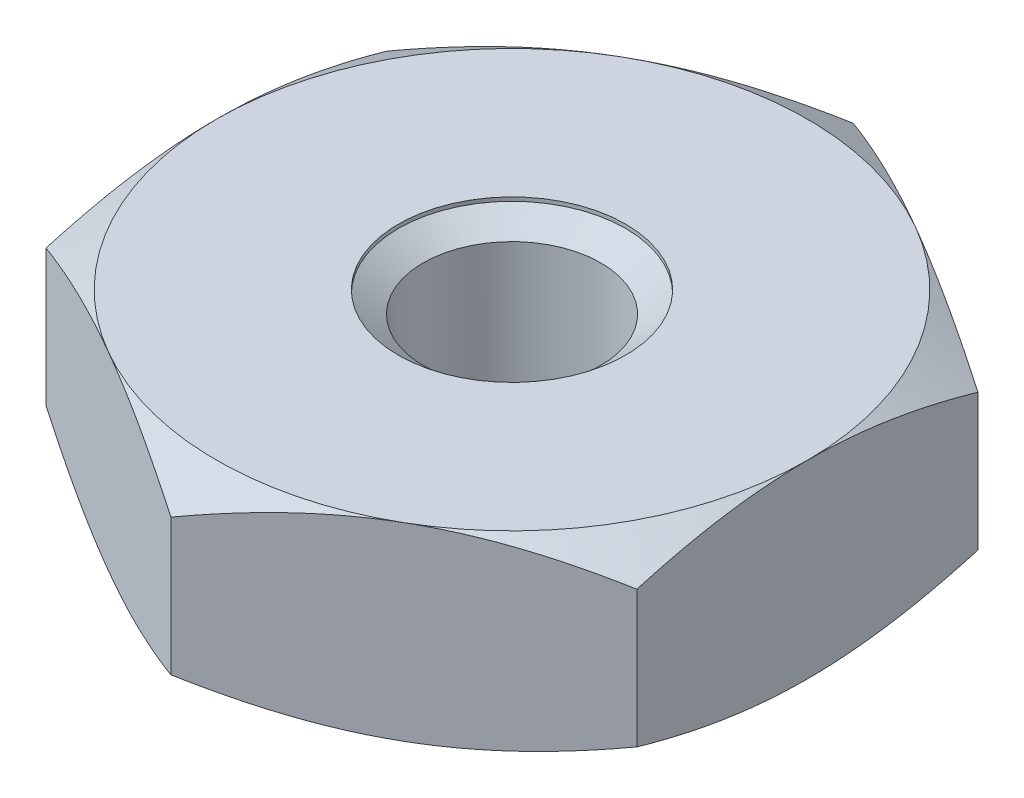
ISO-10303-21;
HEADER;
FILE_DESCRIPTION(('STEP AP214'),'2;1');
FILE_NAME('part.step','',(''),(''),'','','');
FILE_SCHEMA(('AUTOMOTIVE_DESIGN { 1 0 10303 214 1 1 1 1 }'));
ENDSEC;
DATA;
#1=APPLICATION_CONTEXT('core data for automotive mechanical design processes');
#2=APPLICATION_PROTOCOL_DEFINITION('international standard','automotive_design',2000,#1);
#3=PRODUCT_CONTEXT('',#1,'mechanical');
#4=PRODUCT('Part','Part','',(#3));
#5=PRODUCT_RELATED_PRODUCT_CATEGORY('part','',(#4));
#6=PRODUCT_DEFINITION_FORMATION('','',#4);
#7=PRODUCT_DEFINITION_CONTEXT('part definition',#1,'design');
#8=PRODUCT_DEFINITION('design','',#6,#7);
#9=PRODUCT_DEFINITION_SHAPE('','',#8);
#10=(LENGTH_UNIT() NAMED_UNIT(*) SI_UNIT(.MILLI.,.METRE.));
#11=(NAMED_UNIT(*) PLANE_ANGLE_UNIT() SI_UNIT($,.RADIAN.));
#12=(NAMED_UNIT(*) SI_UNIT($,.STERADIAN.) SOLID_ANGLE_UNIT());
#13=UNCERTAINTY_MEASURE_WITH_UNIT(LENGTH_MEASURE(1.E-05),#10,'distance_accuracy_value','');
#14=(GEOMETRIC_REPRESENTATION_CONTEXT(3) GLOBAL_UNCERTAINTY_ASSIGNED_CONTEXT((#13)) GLOBAL_UNIT_ASSIGNED_CONTEXT((#10,
#11,#12)) REPRESENTATION_CONTEXT('',''));
#15=CARTESIAN_POINT('',(0.,0.,0.));
#16=DIRECTION('',(0.,0.,1.));
#17=DIRECTION('',(1.,0.,0.));
#18=AXIS2_PLACEMENT_3D('',#15,#16,#17);
#19=CARTESIAN_POINT('',(16.3253851118081,27.5915510558207,-6.4121978535183));
#20=DIRECTION('',(0.,-1.,0.));
#21=DIRECTION('',(0.,0.,-1.));
#22=AXIS2_PLACEMENT_3D('',#19,#20,#21);
#23=CONICAL_SURFACE('',#22,2.28953166273032,1.04719755123036);
#24=CARTESIAN_POINT('',(16.3253850409871,27.5926127357193,-4.12450514926692));
#25=CARTESIAN_POINT('',(16.4060335239468,27.6194955042522,-4.17106754482156));
#26=CARTESIAN_POINT('',(16.4873066561034,27.6441278271229,-4.21799059820139));
#27=CARTESIAN_POINT('',(16.6505694990082,27.6875667153444,-4.31225043625489));
#28=CARTESIAN_POINT('',(16.7325535141743,27.7064020877897,-4.35958393250993));
#29=CARTESIAN_POINT('',(16.8976147389333,27.7372353558454,-4.45488207722461));
#30=CARTESIAN_POINT('',(16.9806930649247,27.7492256087015,-4.50284737023285));
#31=CARTESIAN_POINT('',(17.105933681734,27.7613588984433,-4.57515507373433));
#32=CARTESIAN_POINT('',(17.1478933067201,27.7644282706281,-4.59938047456979));
#33=CARTESIAN_POINT('',(17.2318950794241,27.7685353303351,-4.64787892076221));
#34=CARTESIAN_POINT('',(17.2739372418358,27.7695726154864,-4.67215197460262));
#35=CARTESIAN_POINT('',(17.3159851118081,27.7695664242838,-4.69642832354059));
#36=B_SPLINE_CURVE_WITH_KNOTS('',3,(#24,#25,#26,#27,#28,#29,#30,#31,#32,#33,#34,#35),
.UNSPECIFIED.,.F.,.F.,(4,2,2,2,2,4),(0.,0.290854703663573,0.580239798096237,0.869947369768375,
1.01555326877727,1.16118799611094),.UNSPECIFIED.);
#37=CARTESIAN_POINT('',(16.3253850829356,27.592612767992,-4.12450513021181));
#38=VERTEX_POINT('',#37);
#39=CARTESIAN_POINT('',(17.31598511181,27.7695664242816,-4.69642832353724));
#40=VERTEX_POINT('',#39);
#41=EDGE_CURVE('E144',#38,#40,#36,.T.);
#42=ORIENTED_EDGE('',*,*,#41,.T.);
#43=CARTESIAN_POINT('',(16.3253851118081,27.7695664242794,-6.4121978535183));
#44=DIRECTION('',(0.,-1.,0.));
#45=DIRECTION('',(0.,0.,-1.));
#46=AXIS2_PLACEMENT_3D('',#43,#44,#45);
#47=CIRCLE('',#46,1.98120000000772);
#48=CARTESIAN_POINT('',(15.3347851118061,27.7695664242816,-4.69642832353724));
#49=VERTEX_POINT('',#48);
#50=EDGE_CURVE('E146',#40,#49,#47,.T.);
#51=ORIENTED_EDGE('',*,*,#50,.T.);
#52=CARTESIAN_POINT('',(15.334785111808,27.7695664242838,-4.69642832354057));
#53=CARTESIAN_POINT('',(15.3768329754694,27.7695726155403,-4.67215197813684));
#54=CARTESIAN_POINT('',(15.4188751316244,27.7685353306719,-4.64787892796345));
#55=CARTESIAN_POINT('',(15.5028768918987,27.7644282721267,-4.59938048905667));
#56=CARTESIAN_POINT('',(15.5448365107117,27.7613589008184,-4.57515509183989));
#57=CARTESIAN_POINT('',(15.6700771092818,27.7492256147681,-4.50284739854199));
#58=CARTESIAN_POINT('',(15.7531554231413,27.7372353657876,-4.45488211167135));
#59=CARTESIAN_POINT('',(15.918216624965,27.7064021051282,-4.35958398236567));
#60=CARTESIAN_POINT('',(16.0002006293294,27.6875667362284,-4.31225049537667));
#61=CARTESIAN_POINT('',(16.1634634461638,27.6441278639002,-4.21799066412864));
#62=CARTESIAN_POINT('',(16.2447365630346,27.619495553441,-4.17106760822542));
#63=CARTESIAN_POINT('',(16.3253850257182,27.5926128063127,-4.12450519658534));
#64=B_SPLINE_CURVE_WITH_KNOTS('',3,(#52,#53,#54,#55,#56,#57,#58,#59,#60,#61,#62,#63),
.UNSPECIFIED.,.F.,.F.,(4,2,2,2,2,4),(0.,0.145634705601468,0.291240583054905,0.580948112814392,
0.870333164356079,1.16118782392487),.UNSPECIFIED.);
#65=EDGE_CURVE('E21',#49,#38,#64,.T.);
#66=ORIENTED_EDGE('',*,*,#65,.T.);
#67=EDGE_LOOP('',(#42,#51,#66));
#68=FACE_BOUND('',#67,.T.);
#69=ADVANCED_FACE('F17',(#68),#23,.T.);
#70=CARTESIAN_POINT('',(16.3253851118081,27.5915510558207,-6.4121978535183));
#71=DIRECTION('',(0.,-1.,0.));
#72=DIRECTION('',(0.,0.,-1.));
#73=AXIS2_PLACEMENT_3D('',#70,#71,#72);
#74=CONICAL_SURFACE('',#73,2.28953166273032,1.04719755123036);
#75=CARTESIAN_POINT('',(16.3253851118081,27.7695664242794,-6.4121978535183));
#76=DIRECTION('',(0.,-1.,0.));
#77=DIRECTION('',(0.,0.,-1.));
#78=AXIS2_PLACEMENT_3D('',#75,#76,#77);
#79=CIRCLE('',#78,1.98120000000772);
#80=CARTESIAN_POINT('',(14.3441851118042,27.7695664242816,-6.41219785351828));
#81=VERTEX_POINT('',#80);
#82=EDGE_CURVE('E153',#49,#81,#79,.T.);
#83=ORIENTED_EDGE('',*,*,#82,.T.);
#84=CARTESIAN_POINT('',(14.3441851118081,27.7695664242838,-6.41219785351828));
#85=CARTESIAN_POINT('',(14.3441851118081,27.7695726155439,-6.36364515572763));
#86=CARTESIAN_POINT('',(14.3441851118081,27.7685353303751,-6.31509904840059));
#87=CARTESIAN_POINT('',(14.3441851118081,27.7644282706528,-6.21810215666983));
#88=CARTESIAN_POINT('',(14.3441851118081,27.761358898468,-6.16965135529928));
#89=CARTESIAN_POINT('',(14.3441851118081,27.7492256089903,-6.02503594816215));
#90=CARTESIAN_POINT('',(14.3441851118081,27.7372353566602,-5.92910536091498));
#91=CARTESIAN_POINT('',(14.3441851118081,27.7064020876812,-5.73850907578837));
#92=CARTESIAN_POINT('',(14.3441851118081,27.6875667138167,-5.64384208879993));
#93=CARTESIAN_POINT('',(14.3441851118081,27.6441278304067,-5.45532240052435));
#94=CARTESIAN_POINT('',(14.3441851118081,27.619495513819,-5.36147627595219));
#95=CARTESIAN_POINT('',(14.3441851118081,27.5926127602655,-5.26835144009565));
#96=B_SPLINE_CURVE_WITH_KNOTS('',3,(#84,#85,#86,#87,#88,#89,#90,#91,#92,#93,#94,#95),
.UNSPECIFIED.,.F.,.F.,(4,2,2,2,2,4),(0.,0.145634726540981,0.291240624913557,0.580948196000669,
0.870333288680379,1.16118798989097),.UNSPECIFIED.);
#97=CARTESIAN_POINT('',(14.344185154875,27.5926127919718,-5.26835147533507));
#98=VERTEX_POINT('',#97);
#99=EDGE_CURVE('E161',#81,#98,#96,.T.);
#100=ORIENTED_EDGE('',*,*,#99,.T.);
#101=CARTESIAN_POINT('',(14.344185197942,27.5926128063274,-5.26835145047035));
#102=CARTESIAN_POINT('',(14.4248336606221,27.6194955534536,-5.22178903883227));
#103=CARTESIAN_POINT('',(14.5061067774893,27.6441278639109,-5.17486598293108));
#104=CARTESIAN_POINT('',(14.6693695943167,27.6875667362356,-5.08060615168717));
#105=CARTESIAN_POINT('',(14.7513535986774,27.7064021051338,-5.03327266470024));
#106=CARTESIAN_POINT('',(14.9164148004938,27.7372353657905,-4.9379745353988));
#107=CARTESIAN_POINT('',(14.9994931143496,27.7492256147699,-4.89000924853032));
#108=CARTESIAN_POINT('',(15.124733712914,27.7613589008191,-4.81770155523569));
#109=CARTESIAN_POINT('',(15.1666933317251,27.7644282721272,-4.79347615802001));
#110=CARTESIAN_POINT('',(15.2506950919956,27.768535330672,-4.74497771911546));
#111=CARTESIAN_POINT('',(15.2927372481486,27.7695726155403,-4.72070466894317));
#112=CARTESIAN_POINT('',(15.334785111808,27.7695664242838,-4.69642832354057));
#113=B_SPLINE_CURVE_WITH_KNOTS('',3,(#101,#102,#103,#104,#105,#106,#107,#108,#109,#110,#111,
#112),.UNSPECIFIED.,.F.,.F.,(4,2,2,2,2,4),(0.,0.290854659555501,0.580239711084058,
0.869947240830358,1.01555311827712,1.16118782387191),.UNSPECIFIED.);
#114=EDGE_CURVE('E137',#98,#49,#113,.T.);
#115=ORIENTED_EDGE('',*,*,#114,.T.);
#116=EDGE_LOOP('',(#83,#100,#115));
#117=FACE_BOUND('',#116,.T.);
#118=ADVANCED_FACE('F159',(#117),#74,.T.);
#119=CARTESIAN_POINT('',(16.3253851118081,27.5915510558207,-6.4121978535183));
#120=DIRECTION('',(0.,-1.,0.));
#121=DIRECTION('',(0.,0.,-1.));
#122=AXIS2_PLACEMENT_3D('',#119,#120,#121);
#123=CONICAL_SURFACE('',#122,2.28953166273032,1.04719755123036);
#124=CARTESIAN_POINT('',(14.3441851493153,27.5926127357104,-7.55604426693794));
#125=CARTESIAN_POINT('',(14.3441851252271,27.619495504254,-7.46291943414642));
#126=CARTESIAN_POINT('',(14.3441851153908,27.6441278271283,-7.36907331036753));
#127=CARTESIAN_POINT('',(14.3441851082435,27.6875667153511,-7.18055362189724));
#128=CARTESIAN_POINT('',(14.3441851108694,27.706402087794,-7.085886633934));
#129=CARTESIAN_POINT('',(14.3441851127478,27.7372353558469,-6.89529034776118));
#130=CARTESIAN_POINT('',(14.3441851119966,27.7492256087026,-6.79935976044786));
#131=CARTESIAN_POINT('',(14.3441851117133,27.7613588984438,-6.65474435295933));
#132=CARTESIAN_POINT('',(14.3441851117607,27.7644282706284,-6.60629355137191));
#133=CARTESIAN_POINT('',(14.3441851118555,27.7685353303351,-6.50929665915408));
#134=CARTESIAN_POINT('',(14.3441851119029,27.7695726154863,-6.46075055155677));
#135=CARTESIAN_POINT('',(14.3441851118081,27.7695664242838,-6.41219785351828));
#136=B_SPLINE_CURVE_WITH_KNOTS('',3,(#124,#125,#126,#127,#128,#129,#130,#131,#132,#133,#134,
#135),.UNSPECIFIED.,.F.,.F.,(4,2,2,2,2,4),(0.,0.290854703655437,0.580239798079513,
0.869947369742058,1.01555326874638,1.1611879960756),.UNSPECIFIED.);
#137=CARTESIAN_POINT('',(14.3441851118081,27.5926127679968,-7.55604424015908));
#138=VERTEX_POINT('',#137);
#139=EDGE_CURVE('E235',#138,#81,#136,.T.);
#140=ORIENTED_EDGE('',*,*,#139,.T.);
#141=CARTESIAN_POINT('',(16.3253851118081,27.7695664242794,-6.4121978535183));
#142=DIRECTION('',(0.,-1.,0.));
#143=DIRECTION('',(0.,0.,-1.));
#144=AXIS2_PLACEMENT_3D('',#141,#142,#143);
#145=CIRCLE('',#144,1.98120000000772);
#146=CARTESIAN_POINT('',(15.3347851118061,27.7695664242816,-8.12796738349937));
#147=VERTEX_POINT('',#146);
#148=EDGE_CURVE('E170',#81,#147,#145,.T.);
#149=ORIENTED_EDGE('',*,*,#148,.T.);
#150=CARTESIAN_POINT('',(15.3347851118081,27.7695664242838,-8.12796738349604));
#151=CARTESIAN_POINT('',(15.2927372481485,27.7695726155403,-8.10369103809336));
#152=CARTESIAN_POINT('',(15.2506950919954,27.768535330672,-8.07941798792101));
#153=CARTESIAN_POINT('',(15.1666933317246,27.7644282721271,-8.03091954901631));
#154=CARTESIAN_POINT('',(15.1247337129134,27.7613589008191,-8.00669415180057));
#155=CARTESIAN_POINT('',(14.9994931143487,27.7492256147698,-7.93438645850573));
#156=CARTESIAN_POINT('',(14.9164148004926,27.7372353657903,-7.88642117163711));
#157=CARTESIAN_POINT('',(14.7513535986758,27.7064021051334,-7.7911230423354));
#158=CARTESIAN_POINT('',(14.6693695943148,27.6875667362351,-7.74378955534835));
#159=CARTESIAN_POINT('',(14.506106777487,27.6441278639102,-7.64952972410418));
#160=CARTESIAN_POINT('',(14.4248336606196,27.6194955534529,-7.60260666820286));
#161=CARTESIAN_POINT('',(14.3441851979393,27.5926128063265,-7.55604425656466));
#162=B_SPLINE_CURVE_WITH_KNOTS('',3,(#150,#151,#152,#153,#154,#155,#156,#157,#158,#159,#160,
#161),.UNSPECIFIED.,.F.,.F.,(4,2,2,2,2,4),(0.,0.145634705595208,0.29124058304239,
0.580948112789519,0.870333164318902,1.16118782387524),.UNSPECIFIED.);
#163=EDGE_CURVE('E373',#147,#138,#162,.T.);
#164=ORIENTED_EDGE('',*,*,#163,.T.);
#165=EDGE_LOOP('',(#140,#149,#164));
#166=FACE_BOUND('',#165,.T.);
#167=ADVANCED_FACE('F215',(#166),#123,.T.);
#168=CARTESIAN_POINT('',(16.3253851118081,27.5915510558207,-6.4121978535183));
#169=DIRECTION('',(0.,-1.,0.));
#170=DIRECTION('',(0.,0.,-1.));
#171=AXIS2_PLACEMENT_3D('',#168,#169,#170);
#172=CONICAL_SURFACE('',#171,2.28953166273032,1.04719755123036);
#173=CARTESIAN_POINT('',(16.3253851016251,27.592612775381,-8.69989054095685));
#174=CARTESIAN_POINT('',(16.2447366305238,27.6194955303817,-8.65332813301083));
#175=CARTESIAN_POINT('',(16.1634635067385,27.6441278458859,-8.60640507660848));
#176=CARTESIAN_POINT('',(16.0002006774174,27.6875667253209,-8.51214524068943));
#177=CARTESIAN_POINT('',(15.9182166674763,27.7064020963043,-8.46481174954819));
#178=CARTESIAN_POINT('',(15.7531554540036,27.7372353609031,-8.36951361284988));
#179=CARTESIAN_POINT('',(15.6700771340722,27.749225611746,-8.32154832274039));
#180=CARTESIAN_POINT('',(15.5448365263325,27.7613588996176,-8.24924062424906));
#181=CARTESIAN_POINT('',(15.5028769044188,27.7644282713708,-8.22501522522521));
#182=CARTESIAN_POINT('',(15.4188751379096,27.7685353305089,-8.17651678268512));
#183=CARTESIAN_POINT('',(15.3768329786206,27.7695726155244,-8.15224373068546));
#184=CARTESIAN_POINT('',(15.3347851118081,27.7695664242838,-8.12796738349604));
#185=B_SPLINE_CURVE_WITH_KNOTS('',3,(#173,#174,#175,#176,#177,#178,#179,#180,#181,#182,#183,
#184),.UNSPECIFIED.,.F.,.F.,(4,2,2,2,2,4),(0.,0.290854681463965,0.580239754429613,
0.869947305349844,1.0155531936191,1.16118791009485),.UNSPECIFIED.);
#186=CARTESIAN_POINT('',(16.3253851047043,27.592612779984,-8.6998905560539));
#187=VERTEX_POINT('',#186);
#188=EDGE_CURVE('E219',#187,#147,#185,.T.);
#189=ORIENTED_EDGE('',*,*,#188,.T.);
#190=CARTESIAN_POINT('',(16.3253851118081,27.7695664242794,-6.4121978535183));
#191=DIRECTION('',(0.,-1.,0.));
#192=DIRECTION('',(0.,0.,-1.));
#193=AXIS2_PLACEMENT_3D('',#190,#191,#192);
#194=CIRCLE('',#193,1.98120000000772);
#195=CARTESIAN_POINT('',(17.31598511181,27.7695664242816,-8.12796738349938));
#196=VERTEX_POINT('',#195);
#197=EDGE_CURVE('E176',#147,#196,#194,.T.);
#198=ORIENTED_EDGE('',*,*,#197,.T.);
#199=CARTESIAN_POINT('',(17.3159851118081,27.7695664242838,-8.12796738349604));
#200=CARTESIAN_POINT('',(17.2739372450762,27.7695726155421,-8.15224373067258));
#201=CARTESIAN_POINT('',(17.2318950858519,27.7685353305212,-8.17651678261804));
#202=CARTESIAN_POINT('',(17.147893319458,27.7644282713783,-8.22501522505795));
#203=CARTESIAN_POINT('',(17.1059336975947,27.761358899625,-8.24924062403581));
#204=CARTESIAN_POINT('',(16.9806930899923,27.7492256118345,-8.32154832254851));
#205=CARTESIAN_POINT('',(16.8976147701941,27.7372353611533,-8.36951361284786));
#206=CARTESIAN_POINT('',(16.7325535567113,27.7064020962697,-8.46481174888492));
#207=CARTESIAN_POINT('',(16.6505695466261,27.6875667248492,-8.51214523917685));
#208=CARTESIAN_POINT('',(16.487306718456,27.6441278468943,-8.60640507696949));
#209=CARTESIAN_POINT('',(16.406033595972,27.6194955333235,-8.65332813611352));
#210=CARTESIAN_POINT('',(16.3253851277585,27.5926127829329,-8.69989055094634));
#211=B_SPLINE_CURVE_WITH_KNOTS('',3,(#199,#200,#201,#202,#203,#204,#205,#206,#207,#208,#209,
#210),.UNSPECIFIED.,.F.,.F.,(4,2,2,2,2,4),(0.,0.145634716233225,0.291240604308072,
0.580948155051101,0.870333227480058,1.16118790819191),.UNSPECIFIED.);
#212=EDGE_CURVE('E226',#196,#187,#211,.T.);
#213=ORIENTED_EDGE('',*,*,#212,.T.);
#214=EDGE_LOOP('',(#189,#198,#213));
#215=FACE_BOUND('',#214,.T.);
#216=ADVANCED_FACE('F208',(#215),#172,.T.);
#217=CARTESIAN_POINT('',(16.3253851118081,27.5915510558207,-6.4121978535183));
#218=DIRECTION('',(0.,-1.,0.));
#219=DIRECTION('',(0.,0.,-1.));
#220=AXIS2_PLACEMENT_3D('',#217,#218,#219);
#221=CONICAL_SURFACE('',#220,2.28953166273032,1.04719755123036);
#222=CARTESIAN_POINT('',(18.3065850743126,27.5926127357157,-5.26835144009019));
#223=CARTESIAN_POINT('',(18.3065850983932,27.6194955042549,-5.36147627288334));
#224=CARTESIAN_POINT('',(18.3065851082265,27.6441278271276,-5.45532239666316));
#225=CARTESIAN_POINT('',(18.3065851153716,27.6875667153495,-5.64384208513475));
#226=CARTESIAN_POINT('',(18.3065851127465,27.7064020877931,-5.73850907309836));
#227=CARTESIAN_POINT('',(18.3065851108686,27.7372353558467,-5.92910535927227));
#228=CARTESIAN_POINT('',(18.3065851116196,27.7492256087024,-6.02503594658628));
#229=CARTESIAN_POINT('',(18.3065851119028,27.7613588984437,-6.16965135407579));
#230=CARTESIAN_POINT('',(18.3065851118554,27.7644282706283,-6.21810215566351));
#231=CARTESIAN_POINT('',(18.3065851117607,27.7685353303351,-6.31509904788192));
#232=CARTESIAN_POINT('',(18.3065851117133,27.7695726154863,-6.36364515547952));
#233=CARTESIAN_POINT('',(18.306585111808,27.7695664242839,-6.4121978535183));
#234=B_SPLINE_CURVE_WITH_KNOTS('',3,(#222,#223,#224,#225,#226,#227,#228,#229,#230,#231,#232,
#233),.UNSPECIFIED.,.F.,.F.,(4,2,2,2,2,4),(0.,0.290854703656878,0.580239798082585,
0.869947369747139,1.01555326875237,1.16118799608245),.UNSPECIFIED.);
#235=CARTESIAN_POINT('',(18.306585111808,27.5926127679959,-5.26835146687431));
#236=VERTEX_POINT('',#235);
#237=CARTESIAN_POINT('',(18.3065851118119,27.7695664242816,-6.4121978535183));
#238=VERTEX_POINT('',#237);
#239=EDGE_CURVE('E183',#236,#238,#234,.T.);
#240=ORIENTED_EDGE('',*,*,#239,.T.);
#241=CARTESIAN_POINT('',(16.3253851118081,27.7695664242794,-6.4121978535183));
#242=DIRECTION('',(0.,-1.,0.));
#243=DIRECTION('',(0.,0.,-1.));
#244=AXIS2_PLACEMENT_3D('',#241,#242,#243);
#245=CIRCLE('',#244,1.98120000000772);
#246=EDGE_CURVE('E737',#238,#40,#245,.T.);
#247=ORIENTED_EDGE('',*,*,#246,.T.);
#248=CARTESIAN_POINT('',(17.3159851118081,27.7695664242838,-4.69642832354059));
#249=CARTESIAN_POINT('',(17.3580329754684,27.7695726155403,-4.72070466894372));
#250=CARTESIAN_POINT('',(17.4000751316224,27.7685353306719,-4.74497771911652));
#251=CARTESIAN_POINT('',(17.4840768918946,27.764428272127,-4.79347615802211));
#252=CARTESIAN_POINT('',(17.5260365107066,27.7613589008188,-4.81770155523831));
#253=CARTESIAN_POINT('',(17.6512771092737,27.7492256147691,-4.89000924853447));
#254=CARTESIAN_POINT('',(17.7343554231312,27.7372353657892,-4.93797453540396));
#255=CARTESIAN_POINT('',(17.8994166249511,27.7064021051312,-5.03327266470739));
#256=CARTESIAN_POINT('',(17.9814006293135,27.6875667362323,-5.08060615169528));
#257=CARTESIAN_POINT('',(18.1446634461441,27.6441278639059,-5.17486598294112));
#258=CARTESIAN_POINT('',(18.225936563013,27.6194955534478,-5.22178903884326));
#259=CARTESIAN_POINT('',(18.3065850256948,27.5926128063206,-5.26835145048228));
#260=B_SPLINE_CURVE_WITH_KNOTS('',3,(#248,#249,#250,#251,#252,#253,#254,#255,#256,#257,#258,
#259),.UNSPECIFIED.,.F.,.F.,(4,2,2,2,2,4),(0.,0.145634705597916,0.291240583047801,
0.580948112800279,0.870333164334979,1.1611878238967),.UNSPECIFIED.);
#261=EDGE_CURVE('E192',#40,#236,#260,.T.);
#262=ORIENTED_EDGE('',*,*,#261,.T.);
#263=EDGE_LOOP('',(#240,#247,#262));
#264=FACE_BOUND('',#263,.T.);
#265=ADVANCED_FACE('F202',(#264),#221,.T.);
#266=CARTESIAN_POINT('',(16.325385111808,51.5370721534146,-6.41219785351838));
#267=DIRECTION('',(0.,-1.,0.));
#268=DIRECTION('',(0.,0.,-1.));
#269=AXIS2_PLACEMENT_3D('',#266,#267,#268);
#270=CYLINDRICAL_SURFACE('',#269,0.761999999999999);
#271=CARTESIAN_POINT('',(16.3253851118081,27.744166424327,-6.4121978535183));
#272=DIRECTION('',(0.,1.,0.));
#273=DIRECTION('',(-1.,0.,0.));
#274=AXIS2_PLACEMENT_3D('',#271,#272,#273);
#275=CIRCLE('',#274,0.762000000046736);
#276=CARTESIAN_POINT('',(15.5633851117614,27.744166424327,-6.4121978535183));
#277=VERTEX_POINT('',#276);
#278=EDGE_CURVE('E735',#277,#277,#275,.F.);
#279=ORIENTED_EDGE('',*,*,#278,.T.);
#280=EDGE_LOOP('',(#279));
#281=FACE_BOUND('',#280,.T.);
#282=CARTESIAN_POINT('',(16.325385111808,27.7695664243214,-6.4121978535183));
#283=DIRECTION('',(0.,-1.,0.));
#284=DIRECTION('',(0.,0.,-1.));
#285=AXIS2_PLACEMENT_3D('',#282,#283,#284);
#286=CIRCLE('',#285,0.761999999999999);
#287=CARTESIAN_POINT('',(16.325385111808,27.7695664243214,-7.1741978535183));
#288=VERTEX_POINT('',#287);
#289=EDGE_CURVE('E154',#288,#288,#286,.F.);
#290=ORIENTED_EDGE('',*,*,#289,.T.);
#291=EDGE_LOOP('',(#290));
#292=FACE_BOUND('',#291,.T.);
#293=ADVANCED_FACE('F207',(#281,#292),#270,.F.);
#294=CARTESIAN_POINT('',(12.3629851118081,27.7695664243214,-6.4121978535183));
#295=DIRECTION('',(0.,-1.,0.));
#296=DIRECTION('',(0.,0.,-1.));
#297=AXIS2_PLACEMENT_3D('',#294,#295,#296);
#298=PLANE('',#297);
#299=CARTESIAN_POINT('',(16.3253851118081,27.7695664242794,-6.4121978535183));
#300=DIRECTION('',(0.,-1.,0.));
#301=DIRECTION('',(0.,0.,-1.));
#302=AXIS2_PLACEMENT_3D('',#299,#300,#301);
#303=CIRCLE('',#302,1.98120000000772);
#304=EDGE_CURVE('E734',#196,#238,#303,.T.);
#305=ORIENTED_EDGE('',*,*,#304,.F.);
#306=ORIENTED_EDGE('',*,*,#197,.F.);
#307=ORIENTED_EDGE('',*,*,#148,.F.);
#308=ORIENTED_EDGE('',*,*,#82,.F.);
#309=ORIENTED_EDGE('',*,*,#50,.F.);
#310=ORIENTED_EDGE('',*,*,#246,.F.);
#311=EDGE_LOOP('',(#305,#306,#307,#308,#309,#310));
#312=FACE_BOUND('',#311,.T.);
#313=ORIENTED_EDGE('',*,*,#289,.F.);
#314=EDGE_LOOP('',(#313));
#315=FACE_BOUND('',#314,.T.);
#316=ADVANCED_FACE('F166',(#312,#315),#298,.F.);
#317=CARTESIAN_POINT('',(16.3253851118081,27.744166424327,-6.4121978535183));
#318=DIRECTION('',(0.,1.,0.));
#319=DIRECTION('',(0.,0.,1.));
#320=AXIS2_PLACEMENT_3D('',#317,#318,#319);
#321=CONICAL_SURFACE('',#320,0.762000000046736,0.959931088922706);
#322=ORIENTED_EDGE('',*,*,#278,.F.);
#323=EDGE_LOOP('',(#322));
#324=FACE_BOUND('',#323,.T.);
#325=CARTESIAN_POINT('',(16.3253851118081,27.6276728961894,-6.4121978535183));
#326=DIRECTION('',(0.,-1.,0.));
#327=DIRECTION('',(0.,0.,-1.));
#328=AXIS2_PLACEMENT_3D('',#325,#326,#327);
#329=CIRCLE('',#328,0.59563);
#330=CARTESIAN_POINT('',(16.3253851118081,27.6276728961894,-7.0078278535183));
#331=VERTEX_POINT('',#330);
#332=EDGE_CURVE('E730',#331,#331,#329,.T.);
#333=ORIENTED_EDGE('',*,*,#332,.T.);
#334=EDGE_LOOP('',(#333));
#335=FACE_BOUND('',#334,.T.);
#336=ADVANCED_FACE('F299',(#324,#335),#321,.F.);
#337=CARTESIAN_POINT('',(16.3253851118081,27.5915510558207,-6.4121978535183));
#338=DIRECTION('',(0.,-1.,0.));
#339=DIRECTION('',(0.,0.,-1.));
#340=AXIS2_PLACEMENT_3D('',#337,#338,#339);
#341=CONICAL_SURFACE('',#340,2.28953166273032,1.04719755123036);
#342=ORIENTED_EDGE('',*,*,#304,.T.);
#343=CARTESIAN_POINT('',(18.306585111808,27.7695664242839,-6.4121978535183));
#344=CARTESIAN_POINT('',(18.306585111808,27.7695726155426,-6.4607505486774));
#345=CARTESIAN_POINT('',(18.306585111808,27.768535330487,-6.50929665337401));
#346=CARTESIAN_POINT('',(18.306585111808,27.7644282712083,-6.60629353986023));
#347=CARTESIAN_POINT('',(18.306585111808,27.7613588993538,-6.65474433861664));
#348=CARTESIAN_POINT('',(18.306585111808,27.7492256111676,-6.799359738013));
#349=CARTESIAN_POINT('',(18.306585111808,27.7372353600998,-6.89529032017062));
#350=CARTESIAN_POINT('',(18.306585111808,27.706402094256,-7.08588659530524));
#351=CARTESIAN_POINT('',(18.306585111808,27.6875667222623,-7.18055357739083));
#352=CARTESIAN_POINT('',(18.306585111808,27.6441278430284,-7.36907325595168));
#353=CARTESIAN_POINT('',(18.306585111808,27.6194955287502,-7.46291937571321));
#354=CARTESIAN_POINT('',(18.306585111808,27.592612777618,-7.55604420683048));
#355=B_SPLINE_CURVE_WITH_KNOTS('',3,(#343,#344,#345,#346,#347,#348,#349,#350,#351,#352,#353,
#354),.UNSPECIFIED.,.F.,.F.,(4,2,2,2,2,4),(0.,0.145634718650153,0.291240609139577,
0.580948164652818,0.870333241830106,1.16118792734843),.UNSPECIFIED.);
#356=CARTESIAN_POINT('',(18.3065851118081,27.592612777617,-7.55604420683365));
#357=VERTEX_POINT('',#356);
#358=EDGE_CURVE('E288',#238,#357,#355,.T.);
#359=ORIENTED_EDGE('',*,*,#358,.T.);
#360=CARTESIAN_POINT('',(17.3159851118122,27.7695664242885,-8.12796738350304));
#361=CARTESIAN_POINT('',(17.3580329792395,27.7695726155442,-8.10369103591912));
#362=CARTESIAN_POINT('',(17.4000751391604,27.7685353304874,-8.07941798356897));
#363=CARTESIAN_POINT('',(17.4840769069446,27.7644282712078,-8.03091954032448));
#364=CARTESIAN_POINT('',(17.5260365295016,27.7613588993536,-8.00669414094672));
#365=CARTESIAN_POINT('',(17.6512771391577,27.7492256111679,-7.93438644124925));
#366=CARTESIAN_POINT('',(17.7343554603059,27.7372353600999,-7.88642115017006));
#367=CARTESIAN_POINT('',(17.8994166764392,27.7064020942558,-7.79112301260237));
#368=CARTESIAN_POINT('',(17.9814006878251,27.6875667222622,-7.74378952155957));
#369=CARTESIAN_POINT('',(18.1446635185723,27.6441278430283,-7.64952968227917));
#370=CARTESIAN_POINT('',(18.2259366423326,27.6194955287501,-7.60260662239842));
#371=CARTESIAN_POINT('',(18.3065851118032,27.5926127776177,-7.55604420683961));
#372=B_SPLINE_CURVE_WITH_KNOTS('',3,(#360,#361,#362,#363,#364,#365,#366,#367,#368,#369,#370,
#371),.UNSPECIFIED.,.F.,.F.,(4,2,2,2,2,4),(0.,0.145634718650051,0.291240609139469,
0.58094816465289,0.870333241830625,1.16118792734924),.UNSPECIFIED.);
#373=EDGE_CURVE('E272',#196,#357,#372,.T.);
#374=ORIENTED_EDGE('',*,*,#373,.F.);
#375=EDGE_LOOP('',(#342,#359,#374));
#376=FACE_BOUND('',#375,.T.);
#377=ADVANCED_FACE('F294',(#376),#341,.T.);
#378=CARTESIAN_POINT('',(16.3253851118081,27.7695664243214,-6.4121978535183));
#379=DIRECTION('',(0.,-1.,0.));
#380=DIRECTION('',(0.,0.,-1.));
#381=AXIS2_PLACEMENT_3D('',#378,#379,#380);
#382=CYLINDRICAL_SURFACE('',#381,0.59563);
#383=CARTESIAN_POINT('',(16.325385111808,26.6160599525165,-6.4121978535183));
#384=DIRECTION('',(0.,-1.,0.));
#385=DIRECTION('',(1.,0.,0.));
#386=AXIS2_PLACEMENT_3D('',#383,#384,#385);
#387=CIRCLE('',#386,0.595630000039687);
#388=CARTESIAN_POINT('',(16.9210151118477,26.6160599525165,-6.4121978535183));
#389=VERTEX_POINT('',#388);
#390=EDGE_CURVE('E281',#389,#389,#387,.T.);
#391=ORIENTED_EDGE('',*,*,#390,.T.);
#392=EDGE_LOOP('',(#391));
#393=FACE_BOUND('',#392,.T.);
#394=ORIENTED_EDGE('',*,*,#332,.F.);
#395=EDGE_LOOP('',(#394));
#396=FACE_BOUND('',#395,.T.);
#397=ADVANCED_FACE('F298',(#393,#396),#382,.F.);
#398=CARTESIAN_POINT('',(18.306585111808,27.7695664243214,-5.26835150019981));
#399=DIRECTION('',(-1.,0.,0.));
#400=DIRECTION('',(0.,0.,1.));
#401=AXIS2_PLACEMENT_3D('',#398,#399,#400);
#402=PLANE('',#401);
#403=DIRECTION('',(0.,1.,0.));
#404=VECTOR('',#403,1.);
#405=CARTESIAN_POINT('',(18.3065851118081,27.7695664243214,-7.55604420683682));
#406=LINE('',#405,#404);
#407=CARTESIAN_POINT('',(18.3065851118081,26.6765200566669,-7.55604415710711));
#408=VERTEX_POINT('',#407);
#409=EDGE_CURVE('E767',#357,#408,#406,.F.);
#410=ORIENTED_EDGE('',*,*,#409,.F.);
#411=ORIENTED_EDGE('',*,*,#358,.F.);
#412=ORIENTED_EDGE('',*,*,#239,.F.);
#413=DIRECTION('',(0.,1.,0.));
#414=VECTOR('',#413,1.);
#415=CARTESIAN_POINT('',(18.306585111808,27.7695664243214,-5.26835150019981));
#416=LINE('',#415,#414);
#417=CARTESIAN_POINT('',(18.3065851406583,26.6765200806394,-5.26835151685649));
#418=VERTEX_POINT('',#417);
#419=EDGE_CURVE('E728',#418,#236,#416,.T.);
#420=ORIENTED_EDGE('',*,*,#419,.F.);
#421=CARTESIAN_POINT('',(18.3065851118015,26.499566424326,-6.41219785351828));
#422=CARTESIAN_POINT('',(18.3065851118057,26.4995602330672,-6.36364516271247));
#423=CARTESIAN_POINT('',(18.3065851118074,26.5005975179347,-6.31509906236735));
#424=CARTESIAN_POINT('',(18.3065851118087,26.5047045764796,-6.21810218455721));
#425=CARTESIAN_POINT('',(18.3065851118083,26.5077739477885,-6.16965139012539));
#426=CARTESIAN_POINT('',(18.3065851118076,26.5199072338406,-6.02503600353505));
#427=CARTESIAN_POINT('',(18.3065851118079,26.5318974828222,-5.92910542979755));
#428=CARTESIAN_POINT('',(18.3065851118082,26.5627307434848,-5.73850917119414));
#429=CARTESIAN_POINT('',(18.3065851118081,26.5815661123866,-5.64384219722031));
#430=CARTESIAN_POINT('',(18.306585111808,26.6250049847195,-5.45532253473275));
#431=CARTESIAN_POINT('',(18.3065851118079,26.6496372951814,-5.36147642293064));
#432=CARTESIAN_POINT('',(18.306585111808,26.6765200423124,-5.26835159965497));
#433=B_SPLINE_CURVE_WITH_KNOTS('',3,(#421,#422,#423,#424,#425,#426,#427,#428,#429,#430,#431,
#432),.UNSPECIFIED.,.F.,.F.,(4,2,2,2,2,4),(0.,0.145634705596404,0.291240583044686,
0.58094811279333,0.870333164323886,1.16118782388205),.UNSPECIFIED.);
#434=CARTESIAN_POINT('',(18.306585111793,26.4995664243136,-6.41219785351828));
#435=VERTEX_POINT('',#434);
#436=EDGE_CURVE('E705',#435,#418,#433,.T.);
#437=ORIENTED_EDGE('',*,*,#436,.F.);
#438=CARTESIAN_POINT('',(18.306585111808,26.6765200423112,-7.55604410737741));
#439=CARTESIAN_POINT('',(18.306585111808,26.6496372951803,-7.46291928410213));
#440=CARTESIAN_POINT('',(18.306585111808,26.6250049847186,-7.36907317230042));
#441=CARTESIAN_POINT('',(18.306585111808,26.5815661123861,-7.1805535098136));
#442=CARTESIAN_POINT('',(18.306585111808,26.5627307434844,-7.08588653584013));
#443=CARTESIAN_POINT('',(18.306585111808,26.5318974828219,-6.89529027723753));
#444=CARTESIAN_POINT('',(18.306585111808,26.5199072338403,-6.79935970350047));
#445=CARTESIAN_POINT('',(18.306585111808,26.5077739477886,-6.65474431691082));
#446=CARTESIAN_POINT('',(18.306585111808,26.50470457648,-6.60629352247925));
#447=CARTESIAN_POINT('',(18.306585111808,26.5005975179344,-6.50929664466966));
#448=CARTESIAN_POINT('',(18.306585111808,26.4995602330658,-6.46075054432484));
#449=CARTESIAN_POINT('',(18.306585111808,26.4995664243223,-6.41219785351936));
#450=B_SPLINE_CURVE_WITH_KNOTS('',3,(#438,#439,#440,#441,#442,#443,#444,#445,#446,#447,#448,
#449),.UNSPECIFIED.,.F.,.F.,(4,2,2,2,2,4),(0.,0.290854659556888,0.580239711086318,
0.869947240833614,1.01555311828114,1.1611878238767),.UNSPECIFIED.);
#451=EDGE_CURVE('E283',#408,#435,#450,.T.);
#452=ORIENTED_EDGE('',*,*,#451,.F.);
#453=EDGE_LOOP('',(#410,#411,#412,#420,#437,#452));
#454=FACE_BOUND('',#453,.T.);
#455=ADVANCED_FACE('F199',(#454),#402,.F.);
#456=CARTESIAN_POINT('',(18.306585111808,27.7695664243214,-5.26835150019981));
#457=DIRECTION('',(0.500000000000001,0.,0.866025403784438));
#458=DIRECTION('',(0.866025403784438,0.,-0.500000000000001));
#459=AXIS2_PLACEMENT_3D('',#456,#457,#458);
#460=PLANE('',#459);
#461=ORIENTED_EDGE('',*,*,#261,.F.);
#462=ORIENTED_EDGE('',*,*,#41,.F.);
#463=DIRECTION('',(0.,1.,0.));
#464=VECTOR('',#463,1.);
#465=CARTESIAN_POINT('',(16.3253851118081,27.7695664243214,-4.12450514688132));
#466=LINE('',#465,#464);
#467=CARTESIAN_POINT('',(16.3253851047005,26.6765200686535,-4.12450515098487));
#468=VERTEX_POINT('',#467);
#469=EDGE_CURVE('E140',#468,#38,#466,.T.);
#470=ORIENTED_EDGE('',*,*,#469,.F.);
#471=CARTESIAN_POINT('',(17.3159851118048,26.4995664243261,-4.69642832354621));
#472=CARTESIAN_POINT('',(17.273937245075,26.4995602330654,-4.67215197636613));
#473=CARTESIAN_POINT('',(17.2318950858516,26.5005975180855,-4.64787892441918));
#474=CARTESIAN_POINT('',(17.1478933194585,26.5047045772283,-4.59938048197822));
#475=CARTESIAN_POINT('',(17.1059336975951,26.5077739489825,-4.57515508300079));
#476=CARTESIAN_POINT('',(16.980693089993,26.5199072367756,-4.50284738448903));
#477=CARTESIAN_POINT('',(16.8976147701954,26.5318974874587,-4.45488209418971));
#478=CARTESIAN_POINT('',(16.7325535567143,26.5627307523474,-4.3595839581533));
#479=CARTESIAN_POINT('',(16.65056954663,26.5815661237711,-4.31225046786199));
#480=CARTESIAN_POINT('',(16.4873067184621,26.6250050017332,-4.21799063007072));
#481=CARTESIAN_POINT('',(16.4060335959792,26.6496373153082,-4.17106757092742));
#482=CARTESIAN_POINT('',(16.3253851277671,26.676520065703,-4.12450515609527));
#483=B_SPLINE_CURVE_WITH_KNOTS('',3,(#471,#472,#473,#474,#475,#476,#477,#478,#479,#480,#481,
#482),.UNSPECIFIED.,.F.,.F.,(4,2,2,2,2,4),(0.,0.145634716233036,0.291240604307603,
0.580948155049421,0.870333227476844,1.16118790818778),.UNSPECIFIED.);
#484=CARTESIAN_POINT('',(17.3159851118006,26.4995664243136,-4.69642832355361));
#485=VERTEX_POINT('',#484);
#486=EDGE_CURVE('E678',#485,#468,#483,.T.);
#487=ORIENTED_EDGE('',*,*,#486,.F.);
#488=CARTESIAN_POINT('',(18.306585145085,26.6765201129261,-5.26835156272736));
#489=CARTESIAN_POINT('',(18.2259366862124,26.6496373443766,-5.22178912546931));
#490=CARTESIAN_POINT('',(18.1446635638938,26.6250050214978,-5.17486605506143));
#491=CARTESIAN_POINT('',(17.9814007281426,26.5815661332679,-5.0806062046377));
#492=CARTESIAN_POINT('',(17.8994167103551,26.5627307608223,-5.03327271293135));
#493=CARTESIAN_POINT('',(17.7343554837258,26.5318974927646,-4.93797457147353));
#494=CARTESIAN_POINT('',(17.6512771584895,26.5199072399069,-4.89000927716695));
#495=CARTESIAN_POINT('',(17.5260365419691,26.5077739501637,-4.81770157317827));
#496=CARTESIAN_POINT('',(17.4840769169374,26.5047045779786,-4.79347617242586));
#497=CARTESIAN_POINT('',(17.4000751441422,26.5005975182712,-4.74497772639957));
#498=CARTESIAN_POINT('',(17.3580329816848,26.4995602331199,-4.72070467264222));
#499=CARTESIAN_POINT('',(17.315985111809,26.4995664243223,-4.69642832354113));
#500=B_SPLINE_CURVE_WITH_KNOTS('',3,(#488,#489,#490,#491,#492,#493,#494,#495,#496,#497,#498,
#499),.UNSPECIFIED.,.F.,.F.,(4,2,2,2,2,4),(0.,0.290854703652359,0.580239798072807,
0.86994736973168,1.01555326873444,1.16118799606213),.UNSPECIFIED.);
#501=EDGE_CURVE('E684',#418,#485,#500,.T.);
#502=ORIENTED_EDGE('',*,*,#501,.F.);
#503=ORIENTED_EDGE('',*,*,#419,.T.);
#504=EDGE_LOOP('',(#461,#462,#470,#487,#502,#503));
#505=FACE_BOUND('',#504,.T.);
#506=ADVANCED_FACE('F461',(#505),#460,.T.);
#507=CARTESIAN_POINT('',(16.325385111808,27.7695664243214,-4.12450514688132));
#508=DIRECTION('',(-0.500000000000001,0.,0.866025403784438));
#509=DIRECTION('',(0.866025403784438,0.,0.500000000000001));
#510=AXIS2_PLACEMENT_3D('',#507,#508,#509);
#511=PLANE('',#510);
#512=ORIENTED_EDGE('',*,*,#65,.F.);
#513=ORIENTED_EDGE('',*,*,#114,.F.);
#514=DIRECTION('',(0.,1.,0.));
#515=VECTOR('',#514,1.);
#516=CARTESIAN_POINT('',(14.3441851118081,27.7695664243214,-5.2683515001998));
#517=LINE('',#516,#515);
#518=CARTESIAN_POINT('',(14.3441851118081,26.6765200566669,-5.2683515499295));
#519=VERTEX_POINT('',#518);
#520=EDGE_CURVE('E762',#519,#98,#517,.T.);
#521=ORIENTED_EDGE('',*,*,#520,.F.);
#522=CARTESIAN_POINT('',(15.3347851118113,26.4995664243261,-4.6964283235462));
#523=CARTESIAN_POINT('',(15.2927372421006,26.4995602330637,-4.72070467243779));
#524=CARTESIAN_POINT('',(15.2506950799,26.5005975182316,-4.74497772609961));
#525=CARTESIAN_POINT('',(15.1666933075731,26.5047045779538,-4.79347617196344));
#526=CARTESIAN_POINT('',(15.1247336827531,26.5077739501394,-4.81770157264885));
#527=CARTESIAN_POINT('',(14.9994930663955,26.5199072396195,-4.89000927621717));
#528=CARTESIAN_POINT('',(14.9164147408404,26.5318974919513,-4.93797456983983));
#529=CARTESIAN_POINT('',(14.7513535160564,26.5627307609351,-5.03327271240139));
#530=CARTESIAN_POINT('',(14.6693695004262,26.5815661348026,-5.08060620589478));
#531=CARTESIAN_POINT('',(14.5061066612693,26.6250050182193,-5.17486605003082));
#532=CARTESIAN_POINT('',(14.4248335333448,26.6496373348107,-5.22178911231597));
#533=CARTESIAN_POINT('',(14.3441850597717,26.6765200883681,-5.26835153024303));
#534=B_SPLINE_CURVE_WITH_KNOTS('',3,(#522,#523,#524,#525,#526,#527,#528,#529,#530,#531,#532,
#533),.UNSPECIFIED.,.F.,.F.,(4,2,2,2,2,4),(0.,0.145634726539779,0.291240624911064,
0.580948195994961,0.870333288671141,1.1611879898788),.UNSPECIFIED.);
#535=CARTESIAN_POINT('',(15.3347851118156,26.4995664243136,-4.69642832355361));
#536=VERTEX_POINT('',#535);
#537=EDGE_CURVE('E348',#536,#519,#534,.T.);
#538=ORIENTED_EDGE('',*,*,#537,.F.);
#539=CARTESIAN_POINT('',(16.3253851016203,26.6765200732598,-4.1245051660913));
#540=CARTESIAN_POINT('',(16.2447366305185,26.6496373182519,-4.17106757403198));
#541=CARTESIAN_POINT('',(16.1634635067335,26.6250050027423,-4.21799063043181));
#542=CARTESIAN_POINT('',(16.0002006774139,26.5815661232991,-4.31225046634836));
#543=CARTESIAN_POINT('',(15.9182166674739,26.5627307523129,-4.35958395748958));
#544=CARTESIAN_POINT('',(15.7531554540028,26.531897487709,-4.45488209418739));
#545=CARTESIAN_POINT('',(15.6700771340719,26.5199072368639,-4.50284738429639));
#546=CARTESIAN_POINT('',(15.5448365263329,26.5077739489901,-4.57515508278729));
#547=CARTESIAN_POINT('',(15.5028769044193,26.5047045772363,-4.59938048181107));
#548=CARTESIAN_POINT('',(15.4188751379104,26.5005975180975,-4.64787892435105));
#549=CARTESIAN_POINT('',(15.3768329786215,26.4995602330818,-4.67215197635067));
#550=CARTESIAN_POINT('',(15.334785111809,26.4995664243223,-4.69642832354002));
#551=B_SPLINE_CURVE_WITH_KNOTS('',3,(#539,#540,#541,#542,#543,#544,#545,#546,#547,#548,#549,
#550),.UNSPECIFIED.,.F.,.F.,(4,2,2,2,2,4),(0.,0.290854681463352,0.58023975442777,
0.869947305346637,1.01555319361553,1.16118791009096),.UNSPECIFIED.);
#552=EDGE_CURVE('E672',#468,#536,#551,.T.);
#553=ORIENTED_EDGE('',*,*,#552,.F.);
#554=ORIENTED_EDGE('',*,*,#469,.T.);
#555=EDGE_LOOP('',(#512,#513,#521,#538,#553,#554));
#556=FACE_BOUND('',#555,.T.);
#557=ADVANCED_FACE('F135',(#556),#511,.T.);
#558=CARTESIAN_POINT('',(14.3441851118081,27.7695664243214,-5.26835150019981));
#559=DIRECTION('',(-1.,0.,0.));
#560=DIRECTION('',(0.,0.,1.));
#561=AXIS2_PLACEMENT_3D('',#558,#559,#560);
#562=PLANE('',#561);
#563=ORIENTED_EDGE('',*,*,#99,.F.);
#564=ORIENTED_EDGE('',*,*,#139,.F.);
#565=DIRECTION('',(0.,1.,0.));
#566=VECTOR('',#565,1.);
#567=CARTESIAN_POINT('',(14.3441851118081,27.7695664243214,-7.55604420683679));
#568=LINE('',#567,#566);
#569=CARTESIAN_POINT('',(14.3441850829531,26.676520080641,-7.55604419017739));
#570=VERTEX_POINT('',#569);
#571=EDGE_CURVE('E667',#570,#138,#568,.T.);
#572=ORIENTED_EDGE('',*,*,#571,.F.);
#573=CARTESIAN_POINT('',(14.3441851118146,26.4995664243261,-6.41219785351829));
#574=CARTESIAN_POINT('',(14.3441851118105,26.4995602330672,-6.46075054432362));
#575=CARTESIAN_POINT('',(14.3441851118087,26.5005975179348,-6.50929664466827));
#576=CARTESIAN_POINT('',(14.3441851118074,26.5047045764796,-6.60629352247746));
#577=CARTESIAN_POINT('',(14.3441851118078,26.5077739477884,-6.6547443169088));
#578=CARTESIAN_POINT('',(14.3441851118085,26.5199072338403,-6.79935970349775));
#579=CARTESIAN_POINT('',(14.3441851118082,26.5318974828216,-6.89529027723433));
#580=CARTESIAN_POINT('',(14.3441851118079,26.5627307434836,-7.08588653583593));
#581=CARTESIAN_POINT('',(14.344185111808,26.5815661123851,-7.18055350980887));
#582=CARTESIAN_POINT('',(14.3441851118081,26.6250049847173,-7.36907317229468));
#583=CARTESIAN_POINT('',(14.3441851118082,26.6496372951787,-7.46291928409592));
#584=CARTESIAN_POINT('',(14.3441851118081,26.6765200423093,-7.55604410737073));
#585=B_SPLINE_CURVE_WITH_KNOTS('',3,(#573,#574,#575,#576,#577,#578,#579,#580,#581,#582,#583,
#584),.UNSPECIFIED.,.F.,.F.,(4,2,2,2,2,4),(0.,0.145634705594978,0.291240583041835,
0.580948112787664,0.870333164315419,1.16118782387075),.UNSPECIFIED.);
#586=CARTESIAN_POINT('',(14.3441851118231,26.4995664243136,-6.41219785351829));
#587=VERTEX_POINT('',#586);
#588=EDGE_CURVE('E340',#587,#570,#585,.T.);
#589=ORIENTED_EDGE('',*,*,#588,.F.);
#590=CARTESIAN_POINT('',(14.3441851118081,26.6765200423112,-5.26835159965921));
#591=CARTESIAN_POINT('',(14.3441851118081,26.6496372951803,-5.36147642293448));
#592=CARTESIAN_POINT('',(14.3441851118081,26.6250049847187,-5.45532253473619));
#593=CARTESIAN_POINT('',(14.3441851118081,26.5815661123861,-5.64384219722299));
#594=CARTESIAN_POINT('',(14.3441851118081,26.5627307434845,-5.73850917119647));
#595=CARTESIAN_POINT('',(14.3441851118081,26.531897482822,-5.92910542979906));
#596=CARTESIAN_POINT('',(14.3441851118081,26.5199072338403,-6.02503600353611));
#597=CARTESIAN_POINT('',(14.3441851118081,26.5077739477887,-6.16965139012576));
#598=CARTESIAN_POINT('',(14.3441851118081,26.50470457648,-6.21810218455732));
#599=CARTESIAN_POINT('',(14.3441851118081,26.5005975179344,-6.31509906236691));
#600=CARTESIAN_POINT('',(14.3441851118081,26.4995602330658,-6.36364516271173));
#601=CARTESIAN_POINT('',(14.3441851118081,26.4995664243223,-6.4121978535172));
#602=B_SPLINE_CURVE_WITH_KNOTS('',3,(#590,#591,#592,#593,#594,#595,#596,#597,#598,#599,#600,
#601),.UNSPECIFIED.,.F.,.F.,(4,2,2,2,2,4),(0.,0.290854659556875,0.580239711086292,
0.869947240833576,1.01555311828109,1.16118782387665),.UNSPECIFIED.);
#603=EDGE_CURVE('E361',#519,#587,#602,.T.);
#604=ORIENTED_EDGE('',*,*,#603,.F.);
#605=ORIENTED_EDGE('',*,*,#520,.T.);
#606=EDGE_LOOP('',(#563,#564,#572,#589,#604,#605));
#607=FACE_BOUND('',#606,.T.);
#608=ADVANCED_FACE('F354',(#607),#562,.T.);
#609=CARTESIAN_POINT('',(14.3441851118081,27.7695664243214,-7.55604420683679));
#610=DIRECTION('',(-0.500000000000001,0.,-0.866025403784438));
#611=DIRECTION('',(-0.866025403784438,0.,0.500000000000001));
#612=AXIS2_PLACEMENT_3D('',#609,#610,#611);
#613=PLANE('',#612);
#614=ORIENTED_EDGE('',*,*,#163,.F.);
#615=ORIENTED_EDGE('',*,*,#188,.F.);
#616=DIRECTION('',(0.,1.,0.));
#617=VECTOR('',#616,1.);
#618=CARTESIAN_POINT('',(16.3253851118081,27.7695664243214,-8.6998905601553));
#619=LINE('',#618,#617);
#620=CARTESIAN_POINT('',(16.3253850829541,26.6765200806407,-8.69989057681417));
#621=VERTEX_POINT('',#620);
#622=EDGE_CURVE('E282',#621,#187,#619,.T.);
#623=ORIENTED_EDGE('',*,*,#622,.F.);
#624=CARTESIAN_POINT('',(15.3347851118113,26.4995664243261,-8.12796738349038));
#625=CARTESIAN_POINT('',(15.3768329754688,26.4995602330672,-8.15224372889666));
#626=CARTESIAN_POINT('',(15.4188751316212,26.5005975179348,-8.17651677907054));
#627=CARTESIAN_POINT('',(15.5028768918912,26.5047045764796,-8.22501521797636));
#628=CARTESIAN_POINT('',(15.5448365107026,26.5077739477884,-8.24924061519171));
#629=CARTESIAN_POINT('',(15.6700771092673,26.5199072338404,-8.32154830848572));
#630=CARTESIAN_POINT('',(15.7531554231228,26.5318974828217,-8.36951359535438));
#631=CARTESIAN_POINT('',(15.9182166249382,26.5627307434838,-8.46481172465558));
#632=CARTESIAN_POINT('',(16.0002006292984,26.5815661123854,-8.51214521164209));
#633=CARTESIAN_POINT('',(16.1634634461243,26.6250049847177,-8.60640504288505));
#634=CARTESIAN_POINT('',(16.2447365629907,26.6496372951792,-8.65332809878569));
#635=CARTESIAN_POINT('',(16.3253850256697,26.6765200423099,-8.6998905104233));
#636=B_SPLINE_CURVE_WITH_KNOTS('',3,(#624,#625,#626,#627,#628,#629,#630,#631,#632,#633,#634,
#635),.UNSPECIFIED.,.F.,.F.,(4,2,2,2,2,4),(0.,0.145634705595253,0.291240583042385,
0.580948112788757,0.870333164317051,1.16118782387293),.UNSPECIFIED.);
#637=CARTESIAN_POINT('',(15.3347851118156,26.4995664243136,-8.12796738348297));
#638=VERTEX_POINT('',#637);
#639=EDGE_CURVE('E46',#638,#621,#636,.T.);
#640=ORIENTED_EDGE('',*,*,#639,.F.);
#641=CARTESIAN_POINT('',(14.3441850785239,26.6765201129313,-7.55604414430115));
#642=CARTESIAN_POINT('',(14.4248335373959,26.6496373443801,-7.60260658156136));
#643=CARTESIAN_POINT('',(14.5061066597147,26.6250050215003,-7.6495296519704));
#644=CARTESIAN_POINT('',(14.6693694954671,26.5815661332692,-7.74378950239553));
#645=CARTESIAN_POINT('',(14.7513535132555,26.5627307608234,-7.79112299410214));
#646=CARTESIAN_POINT('',(14.9164147398864,26.5318974927653,-7.88642113556071));
#647=CARTESIAN_POINT('',(14.9994930651235,26.5199072399074,-7.93438642986779));
#648=CARTESIAN_POINT('',(15.124733681645,26.5077739501639,-8.00669413385717));
#649=CARTESIAN_POINT('',(15.1666933066771,26.5047045779788,-8.0309195346098));
#650=CARTESIAN_POINT('',(15.2506950794731,26.5005975182713,-8.07941798063656));
#651=CARTESIAN_POINT('',(15.2927372419309,26.4995602331199,-8.10369103439414));
#652=CARTESIAN_POINT('',(15.3347851118071,26.4995664243223,-8.12796738349548));
#653=B_SPLINE_CURVE_WITH_KNOTS('',3,(#641,#642,#643,#644,#645,#646,#647,#648,#649,#650,#651,
#652),.UNSPECIFIED.,.F.,.F.,(4,2,2,2,2,4),(0.,0.290854703655265,0.580239798078527,
0.869947369740117,1.01555326874429,1.1611879960734),.UNSPECIFIED.);
#654=EDGE_CURVE('E333',#570,#638,#653,.T.);
#655=ORIENTED_EDGE('',*,*,#654,.F.);
#656=ORIENTED_EDGE('',*,*,#571,.T.);
#657=EDGE_LOOP('',(#614,#615,#623,#640,#655,#656));
#658=FACE_BOUND('',#657,.T.);
#659=ADVANCED_FACE('F247',(#658),#613,.T.);
#660=CARTESIAN_POINT('',(16.3253851118081,27.7695664243214,-8.69989056015529));
#661=DIRECTION('',(0.500000000000001,0.,-0.866025403784438));
#662=DIRECTION('',(-0.866025403784438,0.,-0.500000000000001));
#663=AXIS2_PLACEMENT_3D('',#660,#661,#662);
#664=PLANE('',#663);
#665=ORIENTED_EDGE('',*,*,#212,.F.);
#666=ORIENTED_EDGE('',*,*,#373,.T.);
#667=ORIENTED_EDGE('',*,*,#409,.T.);
#668=CARTESIAN_POINT('',(17.3159851118049,26.4995664243261,-8.1279673834904));
#669=CARTESIAN_POINT('',(17.3580329815156,26.4995602330637,-8.10369103459881));
#670=CARTESIAN_POINT('',(17.4000751437162,26.5005975182316,-8.07941798093698));
#671=CARTESIAN_POINT('',(17.4840769160431,26.5047045779538,-8.03091953507316));
#672=CARTESIAN_POINT('',(17.5260365408631,26.5077739501393,-8.00669413438776));
#673=CARTESIAN_POINT('',(17.6512771572207,26.5199072396194,-7.93438643081943));
#674=CARTESIAN_POINT('',(17.7343554827757,26.5318974919513,-7.88642113719677));
#675=CARTESIAN_POINT('',(17.8994167075598,26.5627307609351,-7.79112299463522));
#676=CARTESIAN_POINT('',(17.9814007231899,26.5815661348025,-7.74378950114183));
#677=CARTESIAN_POINT('',(18.1446635623468,26.6250050182193,-7.64952965700579));
#678=CARTESIAN_POINT('',(18.2259366902713,26.6496373348107,-7.60260659472063));
#679=CARTESIAN_POINT('',(18.3065851638445,26.6765200883681,-7.55604417679357));
#680=B_SPLINE_CURVE_WITH_KNOTS('',3,(#668,#669,#670,#671,#672,#673,#674,#675,#676,#677,#678,
#679),.UNSPECIFIED.,.F.,.F.,(4,2,2,2,2,4),(0.,0.145634726539775,0.291240624911054,
0.580948195994954,0.870333288671128,1.16118798987879),.UNSPECIFIED.);
#681=CARTESIAN_POINT('',(17.3159851118006,26.4995664243136,-8.12796738348298));
#682=VERTEX_POINT('',#681);
#683=EDGE_CURVE('E254',#682,#408,#680,.T.);
#684=ORIENTED_EDGE('',*,*,#683,.F.);
#685=CARTESIAN_POINT('',(16.3253850410106,26.6765201129303,-8.699890557712));
#686=CARTESIAN_POINT('',(16.4060335239758,26.6496373443794,-8.65332816218255));
#687=CARTESIAN_POINT('',(16.4873066561327,26.6250050214998,-8.60640510881408));
#688=CARTESIAN_POINT('',(16.6505694990337,26.5815661332689,-8.51214527077124));
#689=CARTESIAN_POINT('',(16.7325535141955,26.5627307608232,-8.46481177451555));
#690=CARTESIAN_POINT('',(16.8976147389472,26.5318974927651,-8.36951362980288));
#691=CARTESIAN_POINT('',(16.9806930649356,26.5199072399073,-8.3215483367973));
#692=CARTESIAN_POINT('',(17.1059336817402,26.5077739501639,-8.24924063329883));
#693=CARTESIAN_POINT('',(17.1478933067248,26.5047045779787,-8.22501523246417));
#694=CARTESIAN_POINT('',(17.231895079426,26.5005975182713,-8.1765167862733));
#695=CARTESIAN_POINT('',(17.2739372418363,26.4995602331199,-8.15224373243364));
#696=CARTESIAN_POINT('',(17.3159851118072,26.4995664243223,-8.12796738349658));
#697=B_SPLINE_CURVE_WITH_KNOTS('',3,(#685,#686,#687,#688,#689,#690,#691,#692,#693,#694,#695,
#696),.UNSPECIFIED.,.F.,.F.,(4,2,2,2,2,4),(0.,0.290854703654726,0.580239798077462,
0.869947369738548,1.01555326874246,1.1611879960713),.UNSPECIFIED.);
#698=EDGE_CURVE('E263',#621,#682,#697,.T.);
#699=ORIENTED_EDGE('',*,*,#698,.F.);
#700=ORIENTED_EDGE('',*,*,#622,.T.);
#701=EDGE_LOOP('',(#665,#666,#667,#684,#699,#700));
#702=FACE_BOUND('',#701,.T.);
#703=ADVANCED_FACE('F242',(#702),#664,.T.);
#704=CARTESIAN_POINT('',(16.325385111808,26.499566424377,-6.4121978535183));
#705=DIRECTION('',(0.,-1.,0.));
#706=DIRECTION('',(0.,0.,-1.));
#707=AXIS2_PLACEMENT_3D('',#704,#705,#706);
#708=CONICAL_SURFACE('',#707,0.762000000027779,0.959931088532912);
#709=CARTESIAN_POINT('',(16.325385111808,26.4995664243505,-6.4121978535183));
#710=DIRECTION('',(0.,-1.,0.));
#711=DIRECTION('',(0.,0.,-1.));
#712=AXIS2_PLACEMENT_3D('',#709,#710,#711);
#713=CIRCLE('',#712,0.762000000065655);
#714=CARTESIAN_POINT('',(16.325385111808,26.4995664243505,-7.17419785358396));
#715=VERTEX_POINT('',#714);
#716=EDGE_CURVE('E750',#715,#715,#713,.F.);
#717=ORIENTED_EDGE('',*,*,#716,.F.);
#718=EDGE_LOOP('',(#717));
#719=FACE_BOUND('',#718,.T.);
#720=ORIENTED_EDGE('',*,*,#390,.F.);
#721=EDGE_LOOP('',(#720));
#722=FACE_BOUND('',#721,.T.);
#723=ADVANCED_FACE('F246',(#719,#722),#708,.F.);
#724=CARTESIAN_POINT('',(16.3253851118081,26.6775817927964,-6.41219785351829));
#725=DIRECTION('',(0.,1.,0.));
#726=DIRECTION('',(0.,0.,1.));
#727=AXIS2_PLACEMENT_3D('',#724,#725,#726);
#728=CONICAL_SURFACE('',#727,2.28953166269248,1.04719755115053);
#729=CARTESIAN_POINT('',(16.3253851118081,26.4995664243049,-6.41219785351829));
#730=DIRECTION('',(0.,1.,0.));
#731=DIRECTION('',(0.,0.,1.));
#732=AXIS2_PLACEMENT_3D('',#729,#730,#731);
#733=CIRCLE('',#732,1.98119999996988);
#734=EDGE_CURVE('E748',#682,#435,#733,.F.);
#735=ORIENTED_EDGE('',*,*,#734,.F.);
#736=ORIENTED_EDGE('',*,*,#683,.T.);
#737=ORIENTED_EDGE('',*,*,#451,.T.);
#738=EDGE_LOOP('',(#735,#736,#737));
#739=FACE_BOUND('',#738,.T.);
#740=ADVANCED_FACE('F503',(#739),#728,.T.);
#741=CARTESIAN_POINT('',(16.3253851118081,26.6775817927964,-6.41219785351829));
#742=DIRECTION('',(0.,1.,0.));
#743=DIRECTION('',(0.,0.,1.));
#744=AXIS2_PLACEMENT_3D('',#741,#742,#743);
#745=CONICAL_SURFACE('',#744,2.28953166269248,1.04719755115053);
#746=ORIENTED_EDGE('',*,*,#436,.T.);
#747=ORIENTED_EDGE('',*,*,#501,.T.);
#748=CARTESIAN_POINT('',(16.3253851118081,26.4995664243049,-6.41219785351829));
#749=DIRECTION('',(0.,1.,0.));
#750=DIRECTION('',(0.,0.,1.));
#751=AXIS2_PLACEMENT_3D('',#748,#749,#750);
#752=CIRCLE('',#751,1.98119999996989);
#753=EDGE_CURVE('E744',#435,#485,#752,.F.);
#754=ORIENTED_EDGE('',*,*,#753,.F.);
#755=EDGE_LOOP('',(#746,#747,#754));
#756=FACE_BOUND('',#755,.T.);
#757=ADVANCED_FACE('F512',(#756),#745,.T.);
#758=CARTESIAN_POINT('',(16.3253851118081,26.6775817927964,-6.41219785351829));
#759=DIRECTION('',(0.,1.,0.));
#760=DIRECTION('',(0.,0.,1.));
#761=AXIS2_PLACEMENT_3D('',#758,#759,#760);
#762=CONICAL_SURFACE('',#761,2.28953166269248,1.04719755115053);
#763=ORIENTED_EDGE('',*,*,#486,.T.);
#764=ORIENTED_EDGE('',*,*,#552,.T.);
#765=CARTESIAN_POINT('',(16.3253851118081,26.4995664243049,-6.41219785351829));
#766=DIRECTION('',(0.,1.,0.));
#767=DIRECTION('',(0.,0.,1.));
#768=AXIS2_PLACEMENT_3D('',#765,#766,#767);
#769=CIRCLE('',#768,1.98119999996989);
#770=EDGE_CURVE('E742',#485,#536,#769,.F.);
#771=ORIENTED_EDGE('',*,*,#770,.F.);
#772=EDGE_LOOP('',(#763,#764,#771));
#773=FACE_BOUND('',#772,.T.);
#774=ADVANCED_FACE('F521',(#773),#762,.T.);
#775=CARTESIAN_POINT('',(16.3253851118081,26.6775817927964,-6.41219785351829));
#776=DIRECTION('',(0.,1.,0.));
#777=DIRECTION('',(0.,0.,1.));
#778=AXIS2_PLACEMENT_3D('',#775,#776,#777);
#779=CONICAL_SURFACE('',#778,2.28953166269248,1.04719755115053);
#780=CARTESIAN_POINT('',(16.3253851118081,26.4995664243049,-6.41219785351829));
#781=DIRECTION('',(0.,1.,0.));
#782=DIRECTION('',(0.,0.,1.));
#783=AXIS2_PLACEMENT_3D('',#780,#781,#782);
#784=CIRCLE('',#783,1.98119999996988);
#785=EDGE_CURVE('E669',#536,#587,#784,.F.);
#786=ORIENTED_EDGE('',*,*,#785,.F.);
#787=ORIENTED_EDGE('',*,*,#537,.T.);
#788=ORIENTED_EDGE('',*,*,#603,.T.);
#789=EDGE_LOOP('',(#786,#787,#788));
#790=FACE_BOUND('',#789,.T.);
#791=ADVANCED_FACE('F531',(#790),#779,.T.);
#792=CARTESIAN_POINT('',(16.3253851118081,26.6775817927964,-6.41219785351829));
#793=DIRECTION('',(0.,1.,0.));
#794=DIRECTION('',(0.,0.,1.));
#795=AXIS2_PLACEMENT_3D('',#792,#793,#794);
#796=CONICAL_SURFACE('',#795,2.28953166269248,1.04719755115053);
#797=ORIENTED_EDGE('',*,*,#588,.T.);
#798=ORIENTED_EDGE('',*,*,#654,.T.);
#799=CARTESIAN_POINT('',(16.3253851118081,26.4995664243049,-6.41219785351829));
#800=DIRECTION('',(0.,1.,0.));
#801=DIRECTION('',(0.,0.,1.));
#802=AXIS2_PLACEMENT_3D('',#799,#800,#801);
#803=CIRCLE('',#802,1.98119999996988);
#804=EDGE_CURVE('E33',#587,#638,#803,.F.);
#805=ORIENTED_EDGE('',*,*,#804,.F.);
#806=EDGE_LOOP('',(#797,#798,#805));
#807=FACE_BOUND('',#806,.T.);
#808=ADVANCED_FACE('F318',(#807),#796,.T.);
#809=CARTESIAN_POINT('',(16.3253851118081,26.6775817927964,-6.41219785351829));
#810=DIRECTION('',(0.,1.,0.));
#811=DIRECTION('',(0.,0.,1.));
#812=AXIS2_PLACEMENT_3D('',#809,#810,#811);
#813=CONICAL_SURFACE('',#812,2.28953166269248,1.04719755115053);
#814=ORIENTED_EDGE('',*,*,#639,.T.);
#815=ORIENTED_EDGE('',*,*,#698,.T.);
#816=CARTESIAN_POINT('',(16.3253851118081,26.4995664243049,-6.41219785351829));
#817=DIRECTION('',(0.,1.,0.));
#818=DIRECTION('',(0.,0.,1.));
#819=AXIS2_PLACEMENT_3D('',#816,#817,#818);
#820=CIRCLE('',#819,1.98119999996988);
#821=EDGE_CURVE('E11',#638,#682,#820,.F.);
#822=ORIENTED_EDGE('',*,*,#821,.F.);
#823=EDGE_LOOP('',(#814,#815,#822));
#824=FACE_BOUND('',#823,.T.);
#825=ADVANCED_FACE('F312',(#824),#813,.T.);
#826=CARTESIAN_POINT('',(12.3629851118081,26.4995664243214,-6.4121978535183));
#827=DIRECTION('',(0.,-1.,0.));
#828=DIRECTION('',(0.,0.,-1.));
#829=AXIS2_PLACEMENT_3D('',#826,#827,#828);
#830=PLANE('',#829);
#831=ORIENTED_EDGE('',*,*,#804,.T.);
#832=ORIENTED_EDGE('',*,*,#821,.T.);
#833=ORIENTED_EDGE('',*,*,#734,.T.);
#834=ORIENTED_EDGE('',*,*,#753,.T.);
#835=ORIENTED_EDGE('',*,*,#770,.T.);
#836=ORIENTED_EDGE('',*,*,#785,.T.);
#837=EDGE_LOOP('',(#831,#832,#833,#834,#835,#836));
#838=FACE_BOUND('',#837,.T.);
#839=ORIENTED_EDGE('',*,*,#716,.T.);
#840=EDGE_LOOP('',(#839));
#841=FACE_BOUND('',#840,.T.);
#842=ADVANCED_FACE('F310',(#838,#841),#830,.T.);
#843=CLOSED_SHELL('',(#69,#118,#167,#216,#265,#293,#316,#336,#377,#397,#455,#506,#557,#608,#659,
#703,#723,#740,#757,#774,#791,#808,#825,#842));
#844=MANIFOLD_SOLID_BREP('B1',#843);
#845=ADVANCED_BREP_SHAPE_REPRESENTATION('',(#18,#844),#14);
#846=SHAPE_DEFINITION_REPRESENTATION(#9,#845);
ENDSEC;
END-ISO-10303-21;
